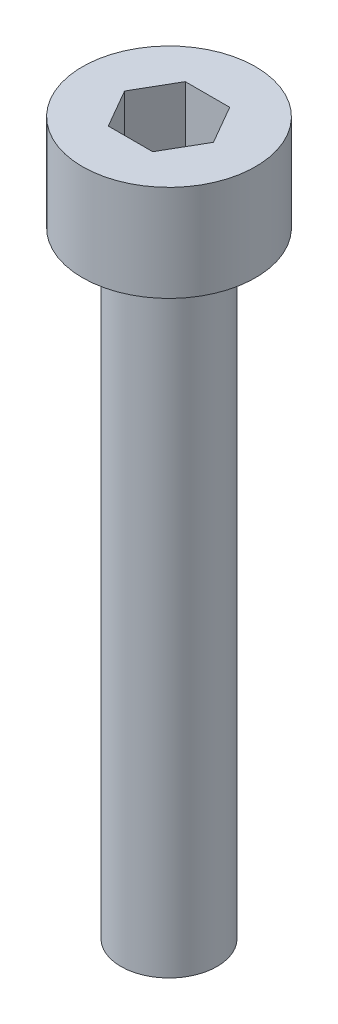
ISO-10303-21;
HEADER;
FILE_DESCRIPTION(('STEP AP214'),'2;1');
FILE_NAME('part.step','',(''),(''),'','','');
FILE_SCHEMA(('AUTOMOTIVE_DESIGN { 1 0 10303 214 1 1 1 1 }'));
ENDSEC;
DATA;
#1=APPLICATION_CONTEXT('core data for automotive mechanical design processes');
#2=APPLICATION_PROTOCOL_DEFINITION('international standard','automotive_design',2000,#1);
#3=PRODUCT_CONTEXT('',#1,'mechanical');
#4=PRODUCT('Part','Part','',(#3));
#5=PRODUCT_RELATED_PRODUCT_CATEGORY('part','',(#4));
#6=PRODUCT_DEFINITION_FORMATION('','',#4);
#7=PRODUCT_DEFINITION_CONTEXT('part definition',#1,'design');
#8=PRODUCT_DEFINITION('design','',#6,#7);
#9=PRODUCT_DEFINITION_SHAPE('','',#8);
#10=(LENGTH_UNIT() NAMED_UNIT(*) SI_UNIT(.MILLI.,.METRE.));
#11=(NAMED_UNIT(*) PLANE_ANGLE_UNIT() SI_UNIT($,.RADIAN.));
#12=(NAMED_UNIT(*) SI_UNIT($,.STERADIAN.) SOLID_ANGLE_UNIT());
#13=UNCERTAINTY_MEASURE_WITH_UNIT(LENGTH_MEASURE(1.E-05),#10,'distance_accuracy_value','');
#14=(GEOMETRIC_REPRESENTATION_CONTEXT(3) GLOBAL_UNCERTAINTY_ASSIGNED_CONTEXT((#13)) GLOBAL_UNIT_ASSIGNED_CONTEXT((#10,
#11,#12)) REPRESENTATION_CONTEXT('',''));
#15=CARTESIAN_POINT('',(0.,0.,0.));
#16=DIRECTION('',(0.,0.,1.));
#17=DIRECTION('',(1.,0.,0.));
#18=AXIS2_PLACEMENT_3D('',#15,#16,#17);
#19=CARTESIAN_POINT('',(2.25000000000004,2.49999999999999,0.));
#20=DIRECTION('',(0.,-1.,0.));
#21=DIRECTION('',(0.,0.,-1.00000000000001));
#22=AXIS2_PLACEMENT_3D('',#19,#20,#21);
#23=PLANE('',#22);
#24=DIRECTION('',(-1.,0.,0.));
#25=VECTOR('',#24,1.);
#26=CARTESIAN_POINT('',(0.577350269189654,2.5,-1.));
#27=LINE('',#26,#25);
#28=CARTESIAN_POINT('',(0.577350269189654,2.5,-1.));
#29=VERTEX_POINT('',#28);
#30=CARTESIAN_POINT('',(-0.577350269189598,2.5,-1.));
#31=VERTEX_POINT('',#30);
#32=EDGE_CURVE('E126',#29,#31,#27,.T.);
#33=ORIENTED_EDGE('',*,*,#32,.F.);
#34=DIRECTION('',(-0.5,0.,-0.866025403784445));
#35=VECTOR('',#34,1.);
#36=CARTESIAN_POINT('',(1.15470053837928,2.5,0.));
#37=LINE('',#36,#35);
#38=CARTESIAN_POINT('',(1.15470053837928,2.5,0.));
#39=VERTEX_POINT('',#38);
#40=EDGE_CURVE('E52',#39,#29,#37,.T.);
#41=ORIENTED_EDGE('',*,*,#40,.F.);
#42=DIRECTION('',(0.5,0.,-0.866025403784448));
#43=VECTOR('',#42,1.);
#44=CARTESIAN_POINT('',(0.577350269189654,2.49999999999999,1.00000000000001));
#45=LINE('',#44,#43);
#46=CARTESIAN_POINT('',(0.577350269189654,2.49999999999999,1.00000000000001));
#47=VERTEX_POINT('',#46);
#48=EDGE_CURVE('E135',#47,#39,#45,.T.);
#49=ORIENTED_EDGE('',*,*,#48,.F.);
#50=DIRECTION('',(1.,0.,0.));
#51=VECTOR('',#50,1.);
#52=CARTESIAN_POINT('',(-0.577350269189598,2.49999999999999,1.00000000000001));
#53=LINE('',#52,#51);
#54=CARTESIAN_POINT('',(-0.577350269189598,2.49999999999999,1.00000000000001));
#55=VERTEX_POINT('',#54);
#56=EDGE_CURVE('E133',#55,#47,#53,.T.);
#57=ORIENTED_EDGE('',*,*,#56,.F.);
#58=DIRECTION('',(0.499999999999999,0.,0.866025403784445));
#59=VECTOR('',#58,1.);
#60=CARTESIAN_POINT('',(-1.15470053837922,2.5,0.));
#61=LINE('',#60,#59);
#62=CARTESIAN_POINT('',(-1.15470053837922,2.5,0.));
#63=VERTEX_POINT('',#62);
#64=EDGE_CURVE('E100',#63,#55,#61,.T.);
#65=ORIENTED_EDGE('',*,*,#64,.F.);
#66=DIRECTION('',(-0.5,0.,0.866025403784448));
#67=VECTOR('',#66,1.);
#68=CARTESIAN_POINT('',(-0.577350269189598,2.5,-1.));
#69=LINE('',#68,#67);
#70=EDGE_CURVE('E129',#31,#63,#69,.T.);
#71=ORIENTED_EDGE('',*,*,#70,.F.);
#72=EDGE_LOOP('',(#33,#41,#49,#57,#65,#71));
#73=FACE_BOUND('',#72,.T.);
#74=CARTESIAN_POINT('',(0.,2.5,0.));
#75=DIRECTION('',(0.,1.,0.));
#76=DIRECTION('',(0.,0.,1.00000000000001));
#77=AXIS2_PLACEMENT_3D('',#74,#75,#76);
#78=CIRCLE('',#77,2.25000000000001);
#79=CARTESIAN_POINT('',(0.,2.5,2.25000000000003));
#80=VERTEX_POINT('',#79);
#81=EDGE_CURVE('E11',#80,#80,#78,.T.);
#82=ORIENTED_EDGE('',*,*,#81,.T.);
#83=EDGE_LOOP('',(#82));
#84=FACE_BOUND('',#83,.T.);
#85=ADVANCED_FACE('F38',(#73,#84),#23,.F.);
#86=CARTESIAN_POINT('',(0.,61.6916426261036,0.));
#87=DIRECTION('',(0.,1.,0.));
#88=DIRECTION('',(0.,0.,1.00000000000001));
#89=AXIS2_PLACEMENT_3D('',#86,#87,#88);
#90=CYLINDRICAL_SURFACE('',#89,2.25000000000001);
#91=ORIENTED_EDGE('',*,*,#81,.F.);
#92=EDGE_LOOP('',(#91));
#93=FACE_BOUND('',#92,.T.);
#94=CARTESIAN_POINT('',(0.,0.,0.));
#95=DIRECTION('',(0.,1.,0.));
#96=DIRECTION('',(0.,0.,1.00000000000001));
#97=AXIS2_PLACEMENT_3D('',#94,#95,#96);
#98=CIRCLE('',#97,2.25000000000001);
#99=CARTESIAN_POINT('',(0.,0.,2.25000000000003));
#100=VERTEX_POINT('',#99);
#101=EDGE_CURVE('E45',#100,#100,#98,.T.);
#102=ORIENTED_EDGE('',*,*,#101,.T.);
#103=EDGE_LOOP('',(#102));
#104=FACE_BOUND('',#103,.T.);
#105=ADVANCED_FACE('F152',(#93,#104),#90,.T.);
#106=CARTESIAN_POINT('',(1.25000000000001,0.,0.));
#107=DIRECTION('',(0.,1.,0.));
#108=DIRECTION('',(0.,0.,1.00000000000001));
#109=AXIS2_PLACEMENT_3D('',#106,#107,#108);
#110=PLANE('',#109);
#111=ORIENTED_EDGE('',*,*,#101,.F.);
#112=EDGE_LOOP('',(#111));
#113=FACE_BOUND('',#112,.T.);
#114=CARTESIAN_POINT('',(0.,0.,0.));
#115=DIRECTION('',(0.,1.,0.));
#116=DIRECTION('',(0.,0.,1.00000000000001));
#117=AXIS2_PLACEMENT_3D('',#114,#115,#116);
#118=CIRCLE('',#117,1.25000000000001);
#119=CARTESIAN_POINT('',(0.,0.,1.25000000000002));
#120=VERTEX_POINT('',#119);
#121=EDGE_CURVE('E147',#120,#120,#118,.T.);
#122=ORIENTED_EDGE('',*,*,#121,.T.);
#123=EDGE_LOOP('',(#122));
#124=FACE_BOUND('',#123,.T.);
#125=ADVANCED_FACE('F154',(#113,#124),#110,.F.);
#126=CARTESIAN_POINT('',(0.,61.6916426261036,0.));
#127=DIRECTION('',(0.,1.,0.));
#128=DIRECTION('',(0.,0.,1.00000000000001));
#129=AXIS2_PLACEMENT_3D('',#126,#127,#128);
#130=CYLINDRICAL_SURFACE('',#129,1.25000000000001);
#131=ORIENTED_EDGE('',*,*,#121,.F.);
#132=EDGE_LOOP('',(#131));
#133=FACE_BOUND('',#132,.T.);
#134=CARTESIAN_POINT('',(0.,-16.,0.));
#135=DIRECTION('',(0.,1.,0.));
#136=DIRECTION('',(0.,0.,1.00000000000001));
#137=AXIS2_PLACEMENT_3D('',#134,#135,#136);
#138=CIRCLE('',#137,1.25000000000001);
#139=CARTESIAN_POINT('',(0.,-16.,1.25000000000008));
#140=VERTEX_POINT('',#139);
#141=EDGE_CURVE('E139',#140,#140,#138,.T.);
#142=ORIENTED_EDGE('',*,*,#141,.T.);
#143=EDGE_LOOP('',(#142));
#144=FACE_BOUND('',#143,.T.);
#145=ADVANCED_FACE('F157',(#133,#144),#130,.T.);
#146=CARTESIAN_POINT('',(0.,-16.,0.));
#147=DIRECTION('',(0.,1.,0.));
#148=DIRECTION('',(0.,0.,1.00000000000001));
#149=AXIS2_PLACEMENT_3D('',#146,#147,#148);
#150=PLANE('',#149);
#151=ORIENTED_EDGE('',*,*,#141,.F.);
#152=EDGE_LOOP('',(#151));
#153=FACE_BOUND('',#152,.T.);
#154=ADVANCED_FACE('F163',(#153),#150,.F.);
#155=CARTESIAN_POINT('',(1.15470053837928,1.,0.));
#156=DIRECTION('',(0.86602540378444,0.,-0.500000000000007));
#157=DIRECTION('',(-0.5,0.,-0.866025403784445));
#158=AXIS2_PLACEMENT_3D('',#155,#156,#157);
#159=PLANE('',#158);
#160=ORIENTED_EDGE('',*,*,#40,.T.);
#161=DIRECTION('',(0.,1.,0.));
#162=VECTOR('',#161,1.);
#163=CARTESIAN_POINT('',(0.577350269189654,1.,-1.));
#164=LINE('',#163,#162);
#165=CARTESIAN_POINT('',(0.577350269189654,1.,-1.));
#166=VERTEX_POINT('',#165);
#167=EDGE_CURVE('E82',#166,#29,#164,.T.);
#168=ORIENTED_EDGE('',*,*,#167,.F.);
#169=DIRECTION('',(-0.5,0.,-0.866025403784445));
#170=VECTOR('',#169,1.);
#171=CARTESIAN_POINT('',(1.15470053837928,1.,0.));
#172=LINE('',#171,#170);
#173=CARTESIAN_POINT('',(1.15470053837928,1.,0.));
#174=VERTEX_POINT('',#173);
#175=EDGE_CURVE('E137',#174,#166,#172,.T.);
#176=ORIENTED_EDGE('',*,*,#175,.F.);
#177=DIRECTION('',(0.,1.,0.));
#178=VECTOR('',#177,1.);
#179=CARTESIAN_POINT('',(1.15470053837928,1.,0.));
#180=LINE('',#179,#178);
#181=EDGE_CURVE('E60',#174,#39,#180,.T.);
#182=ORIENTED_EDGE('',*,*,#181,.T.);
#183=EDGE_LOOP('',(#160,#168,#176,#182));
#184=FACE_BOUND('',#183,.T.);
#185=ADVANCED_FACE('F168',(#184),#159,.F.);
#186=CARTESIAN_POINT('',(0.577350269189654,0.999999999999987,1.00000000000001));
#187=DIRECTION('',(0.866025403784437,0.,0.500000000000004));
#188=DIRECTION('',(0.5,0.,-0.866025403784448));
#189=AXIS2_PLACEMENT_3D('',#186,#187,#188);
#190=PLANE('',#189);
#191=ORIENTED_EDGE('',*,*,#48,.T.);
#192=ORIENTED_EDGE('',*,*,#181,.F.);
#193=DIRECTION('',(0.5,0.,-0.866025403784448));
#194=VECTOR('',#193,1.);
#195=CARTESIAN_POINT('',(0.577350269189654,0.999999999999987,1.00000000000001));
#196=LINE('',#195,#194);
#197=CARTESIAN_POINT('',(0.577350269189654,0.999999999999987,1.00000000000001));
#198=VERTEX_POINT('',#197);
#199=EDGE_CURVE('E112',#198,#174,#196,.T.);
#200=ORIENTED_EDGE('',*,*,#199,.F.);
#201=DIRECTION('',(0.,1.,0.));
#202=VECTOR('',#201,1.);
#203=CARTESIAN_POINT('',(0.577350269189654,0.999999999999987,1.00000000000001));
#204=LINE('',#203,#202);
#205=EDGE_CURVE('E104',#198,#47,#204,.T.);
#206=ORIENTED_EDGE('',*,*,#205,.T.);
#207=EDGE_LOOP('',(#191,#192,#200,#206));
#208=FACE_BOUND('',#207,.T.);
#209=ADVANCED_FACE('F173',(#208),#190,.F.);
#210=CARTESIAN_POINT('',(-0.577350269189598,0.999999999999987,1.00000000000001));
#211=DIRECTION('',(0.,0.,1.00000000000001));
#212=DIRECTION('',(1.,0.,0.));
#213=AXIS2_PLACEMENT_3D('',#210,#211,#212);
#214=PLANE('',#213);
#215=ORIENTED_EDGE('',*,*,#56,.T.);
#216=ORIENTED_EDGE('',*,*,#205,.F.);
#217=DIRECTION('',(1.,0.,0.));
#218=VECTOR('',#217,1.);
#219=CARTESIAN_POINT('',(-0.577350269189598,0.999999999999987,1.00000000000001));
#220=LINE('',#219,#218);
#221=CARTESIAN_POINT('',(-0.577350269189598,0.999999999999987,1.00000000000001));
#222=VERTEX_POINT('',#221);
#223=EDGE_CURVE('E108',#222,#198,#220,.T.);
#224=ORIENTED_EDGE('',*,*,#223,.F.);
#225=DIRECTION('',(0.,1.,0.));
#226=VECTOR('',#225,1.);
#227=CARTESIAN_POINT('',(-0.577350269189598,0.999999999999987,1.00000000000001));
#228=LINE('',#227,#226);
#229=EDGE_CURVE('E93',#222,#55,#228,.T.);
#230=ORIENTED_EDGE('',*,*,#229,.T.);
#231=EDGE_LOOP('',(#215,#216,#224,#230));
#232=FACE_BOUND('',#231,.T.);
#233=ADVANCED_FACE('F109',(#232),#214,.F.);
#234=CARTESIAN_POINT('',(-1.15470053837922,1.,0.));
#235=DIRECTION('',(-0.86602540378444,0.,0.500000000000007));
#236=DIRECTION('',(0.5,0.,0.866025403784445));
#237=AXIS2_PLACEMENT_3D('',#234,#235,#236);
#238=PLANE('',#237);
#239=ORIENTED_EDGE('',*,*,#64,.T.);
#240=ORIENTED_EDGE('',*,*,#229,.F.);
#241=DIRECTION('',(0.499999999999999,0.,0.866025403784445));
#242=VECTOR('',#241,1.);
#243=CARTESIAN_POINT('',(-1.15470053837922,1.,0.));
#244=LINE('',#243,#242);
#245=CARTESIAN_POINT('',(-1.15470053837922,1.,0.));
#246=VERTEX_POINT('',#245);
#247=EDGE_CURVE('E97',#246,#222,#244,.T.);
#248=ORIENTED_EDGE('',*,*,#247,.F.);
#249=DIRECTION('',(0.,1.,0.));
#250=VECTOR('',#249,1.);
#251=CARTESIAN_POINT('',(-1.15470053837922,1.,0.));
#252=LINE('',#251,#250);
#253=EDGE_CURVE('E105',#246,#63,#252,.T.);
#254=ORIENTED_EDGE('',*,*,#253,.T.);
#255=EDGE_LOOP('',(#239,#240,#248,#254));
#256=FACE_BOUND('',#255,.T.);
#257=ADVANCED_FACE('F95',(#256),#238,.F.);
#258=CARTESIAN_POINT('',(-0.577350269189598,0.999999999999997,-1.));
#259=DIRECTION('',(-0.866025403784437,0.,-0.500000000000004));
#260=DIRECTION('',(-0.5,0.,0.866025403784448));
#261=AXIS2_PLACEMENT_3D('',#258,#259,#260);
#262=PLANE('',#261);
#263=ORIENTED_EDGE('',*,*,#70,.T.);
#264=ORIENTED_EDGE('',*,*,#253,.F.);
#265=DIRECTION('',(-0.5,0.,0.866025403784448));
#266=VECTOR('',#265,1.);
#267=CARTESIAN_POINT('',(-0.577350269189598,0.999999999999997,-1.));
#268=LINE('',#267,#266);
#269=CARTESIAN_POINT('',(-0.577350269189598,0.999999999999997,-1.));
#270=VERTEX_POINT('',#269);
#271=EDGE_CURVE('E118',#270,#246,#268,.T.);
#272=ORIENTED_EDGE('',*,*,#271,.F.);
#273=DIRECTION('',(0.,1.,0.));
#274=VECTOR('',#273,1.);
#275=CARTESIAN_POINT('',(-0.577350269189598,0.999999999999997,-1.));
#276=LINE('',#275,#274);
#277=EDGE_CURVE('E142',#270,#31,#276,.T.);
#278=ORIENTED_EDGE('',*,*,#277,.T.);
#279=EDGE_LOOP('',(#263,#264,#272,#278));
#280=FACE_BOUND('',#279,.T.);
#281=ADVANCED_FACE('F199',(#280),#262,.F.);
#282=CARTESIAN_POINT('',(0.577350269189654,1.,-1.));
#283=DIRECTION('',(0.,0.,-1.00000000000001));
#284=DIRECTION('',(-1.,0.,0.));
#285=AXIS2_PLACEMENT_3D('',#282,#283,#284);
#286=PLANE('',#285);
#287=ORIENTED_EDGE('',*,*,#32,.T.);
#288=ORIENTED_EDGE('',*,*,#277,.F.);
#289=DIRECTION('',(-1.,0.,0.));
#290=VECTOR('',#289,1.);
#291=CARTESIAN_POINT('',(0.577350269189654,1.,-1.));
#292=LINE('',#291,#290);
#293=EDGE_CURVE('E120',#166,#270,#292,.T.);
#294=ORIENTED_EDGE('',*,*,#293,.F.);
#295=ORIENTED_EDGE('',*,*,#167,.T.);
#296=EDGE_LOOP('',(#287,#288,#294,#295));
#297=FACE_BOUND('',#296,.T.);
#298=ADVANCED_FACE('F187',(#297),#286,.F.);
#299=CARTESIAN_POINT('',(0.,0.999999999999997,-2.));
#300=DIRECTION('',(0.,1.,0.));
#301=DIRECTION('',(0.,0.,1.00000000000001));
#302=AXIS2_PLACEMENT_3D('',#299,#300,#301);
#303=PLANE('',#302);
#304=ORIENTED_EDGE('',*,*,#175,.T.);
#305=ORIENTED_EDGE('',*,*,#293,.T.);
#306=ORIENTED_EDGE('',*,*,#271,.T.);
#307=ORIENTED_EDGE('',*,*,#247,.T.);
#308=ORIENTED_EDGE('',*,*,#223,.T.);
#309=ORIENTED_EDGE('',*,*,#199,.T.);
#310=EDGE_LOOP('',(#304,#305,#306,#307,#308,#309));
#311=FACE_BOUND('',#310,.T.);
#312=ADVANCED_FACE('F115',(#311),#303,.T.);
#313=CLOSED_SHELL('',(#85,#105,#125,#145,#154,#185,#209,#233,#257,#281,#298,#312));
#314=MANIFOLD_SOLID_BREP('B2',#313);
#315=ADVANCED_BREP_SHAPE_REPRESENTATION('',(#18,#314),#14);
#316=SHAPE_DEFINITION_REPRESENTATION(#9,#315);
ENDSEC;
END-ISO-10303-21;
